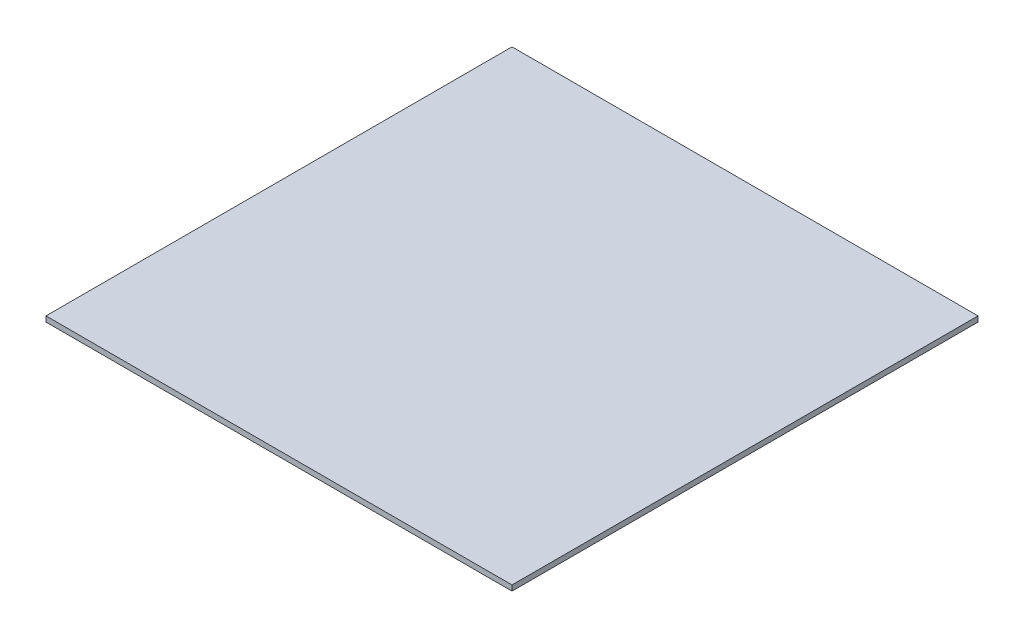
ISO-10303-21;
HEADER;
FILE_DESCRIPTION(('STEP AP214'),'2;1');
FILE_NAME('part.step','',(''),(''),'','','');
FILE_SCHEMA(('AUTOMOTIVE_DESIGN { 1 0 10303 214 1 1 1 1 }'));
ENDSEC;
DATA;
#1=APPLICATION_CONTEXT('core data for automotive mechanical design processes');
#2=APPLICATION_PROTOCOL_DEFINITION('international standard','automotive_design',2000,#1);
#3=PRODUCT_CONTEXT('',#1,'mechanical');
#4=PRODUCT('Part','Part','',(#3));
#5=PRODUCT_RELATED_PRODUCT_CATEGORY('part','',(#4));
#6=PRODUCT_DEFINITION_FORMATION('','',#4);
#7=PRODUCT_DEFINITION_CONTEXT('part definition',#1,'design');
#8=PRODUCT_DEFINITION('design','',#6,#7);
#9=PRODUCT_DEFINITION_SHAPE('','',#8);
#10=(LENGTH_UNIT() NAMED_UNIT(*) SI_UNIT(.MILLI.,.METRE.));
#11=(NAMED_UNIT(*) PLANE_ANGLE_UNIT() SI_UNIT($,.RADIAN.));
#12=(NAMED_UNIT(*) SI_UNIT($,.STERADIAN.) SOLID_ANGLE_UNIT());
#13=UNCERTAINTY_MEASURE_WITH_UNIT(LENGTH_MEASURE(1.E-05),#10,'distance_accuracy_value','');
#14=(GEOMETRIC_REPRESENTATION_CONTEXT(3) GLOBAL_UNCERTAINTY_ASSIGNED_CONTEXT((#13)) GLOBAL_UNIT_ASSIGNED_CONTEXT((#10,
#11,#12)) REPRESENTATION_CONTEXT('',''));
#15=CARTESIAN_POINT('',(0.,0.,0.));
#16=DIRECTION('',(0.,0.,1.));
#17=DIRECTION('',(1.,0.,0.));
#18=AXIS2_PLACEMENT_3D('',#15,#16,#17);
#19=CARTESIAN_POINT('',(-5002.83870967742,5.,-2278.45161290323));
#20=DIRECTION('',(1.,0.,0.));
#21=DIRECTION('',(0.,0.,-1.));
#22=AXIS2_PLACEMENT_3D('',#19,#20,#21);
#23=PLANE('',#22);
#24=DIRECTION('',(0.,0.,1.));
#25=VECTOR('',#24,1.);
#26=CARTESIAN_POINT('',(-5002.83870967742,0.,-2278.45161290323));
#27=LINE('',#26,#25);
#28=CARTESIAN_POINT('',(-5002.83870967742,0.,-2278.45161290323));
#29=VERTEX_POINT('',#28);
#30=CARTESIAN_POINT('',(-5002.83870967742,0.,-1846.45161290323));
#31=VERTEX_POINT('',#30);
#32=EDGE_CURVE('E95',#29,#31,#27,.T.);
#33=ORIENTED_EDGE('',*,*,#32,.T.);
#34=DIRECTION('',(0.,-1.,0.));
#35=VECTOR('',#34,1.);
#36=CARTESIAN_POINT('',(-5002.83870967742,5.,-1846.45161290323));
#37=LINE('',#36,#35);
#38=CARTESIAN_POINT('',(-5002.83870967742,5.,-1846.45161290323));
#39=VERTEX_POINT('',#38);
#40=EDGE_CURVE('E11',#39,#31,#37,.T.);
#41=ORIENTED_EDGE('',*,*,#40,.F.);
#42=DIRECTION('',(0.,0.,1.));
#43=VECTOR('',#42,1.);
#44=CARTESIAN_POINT('',(-5002.83870967742,5.,-2278.45161290323));
#45=LINE('',#44,#43);
#46=CARTESIAN_POINT('',(-5002.83870967742,5.,-2278.45161290323));
#47=VERTEX_POINT('',#46);
#48=EDGE_CURVE('E83',#47,#39,#45,.T.);
#49=ORIENTED_EDGE('',*,*,#48,.F.);
#50=DIRECTION('',(0.,-1.,0.));
#51=VECTOR('',#50,1.);
#52=CARTESIAN_POINT('',(-5002.83870967742,5.,-2278.45161290323));
#53=LINE('',#52,#51);
#54=EDGE_CURVE('E91',#47,#29,#53,.T.);
#55=ORIENTED_EDGE('',*,*,#54,.T.);
#56=EDGE_LOOP('',(#33,#41,#49,#55));
#57=FACE_BOUND('',#56,.T.);
#58=ADVANCED_FACE('F32',(#57),#23,.F.);
#59=CARTESIAN_POINT('',(-5002.83870967742,5.,-1846.45161290323));
#60=DIRECTION('',(0.,0.,-1.));
#61=DIRECTION('',(-1.,0.,0.));
#62=AXIS2_PLACEMENT_3D('',#59,#60,#61);
#63=PLANE('',#62);
#64=DIRECTION('',(1.,0.,0.));
#65=VECTOR('',#64,1.);
#66=CARTESIAN_POINT('',(-5002.83870967742,0.,-1846.45161290323));
#67=LINE('',#66,#65);
#68=CARTESIAN_POINT('',(-4570.83870967742,0.,-1846.45161290323));
#69=VERTEX_POINT('',#68);
#70=EDGE_CURVE('E87',#31,#69,#67,.T.);
#71=ORIENTED_EDGE('',*,*,#70,.T.);
#72=DIRECTION('',(0.,-1.,0.));
#73=VECTOR('',#72,1.);
#74=CARTESIAN_POINT('',(-4570.83870967742,5.,-1846.45161290323));
#75=LINE('',#74,#73);
#76=CARTESIAN_POINT('',(-4570.83870967742,5.,-1846.45161290323));
#77=VERTEX_POINT('',#76);
#78=EDGE_CURVE('E40',#77,#69,#75,.T.);
#79=ORIENTED_EDGE('',*,*,#78,.F.);
#80=DIRECTION('',(1.,0.,0.));
#81=VECTOR('',#80,1.);
#82=CARTESIAN_POINT('',(-5002.83870967742,5.,-1846.45161290323));
#83=LINE('',#82,#81);
#84=EDGE_CURVE('E78',#39,#77,#83,.T.);
#85=ORIENTED_EDGE('',*,*,#84,.F.);
#86=ORIENTED_EDGE('',*,*,#40,.T.);
#87=EDGE_LOOP('',(#71,#79,#85,#86));
#88=FACE_BOUND('',#87,.T.);
#89=ADVANCED_FACE('F86',(#88),#63,.F.);
#90=CARTESIAN_POINT('',(-4570.83870967742,5.,-2278.45161290323));
#91=DIRECTION('',(-1.,0.,0.));
#92=DIRECTION('',(0.,0.,1.));
#93=AXIS2_PLACEMENT_3D('',#90,#91,#92);
#94=PLANE('',#93);
#95=DIRECTION('',(0.,0.,-1.));
#96=VECTOR('',#95,1.);
#97=CARTESIAN_POINT('',(-4570.83870967742,0.,-2278.45161290323));
#98=LINE('',#97,#96);
#99=CARTESIAN_POINT('',(-4570.83870967742,0.,-2278.45161290323));
#100=VERTEX_POINT('',#99);
#101=EDGE_CURVE('E65',#69,#100,#98,.T.);
#102=ORIENTED_EDGE('',*,*,#101,.T.);
#103=DIRECTION('',(0.,-1.,0.));
#104=VECTOR('',#103,1.);
#105=CARTESIAN_POINT('',(-4570.83870967742,5.,-2278.45161290323));
#106=LINE('',#105,#104);
#107=CARTESIAN_POINT('',(-4570.83870967742,5.,-2278.45161290323));
#108=VERTEX_POINT('',#107);
#109=EDGE_CURVE('E88',#108,#100,#106,.T.);
#110=ORIENTED_EDGE('',*,*,#109,.F.);
#111=DIRECTION('',(0.,0.,-1.));
#112=VECTOR('',#111,1.);
#113=CARTESIAN_POINT('',(-4570.83870967742,5.,-2278.45161290323));
#114=LINE('',#113,#112);
#115=EDGE_CURVE('E81',#77,#108,#114,.T.);
#116=ORIENTED_EDGE('',*,*,#115,.F.);
#117=ORIENTED_EDGE('',*,*,#78,.T.);
#118=EDGE_LOOP('',(#102,#110,#116,#117));
#119=FACE_BOUND('',#118,.T.);
#120=ADVANCED_FACE('F89',(#119),#94,.F.);
#121=CARTESIAN_POINT('',(-5002.83870967742,5.,-2278.45161290323));
#122=DIRECTION('',(0.,0.,1.));
#123=DIRECTION('',(1.,0.,0.));
#124=AXIS2_PLACEMENT_3D('',#121,#122,#123);
#125=PLANE('',#124);
#126=DIRECTION('',(-1.,0.,0.));
#127=VECTOR('',#126,1.);
#128=CARTESIAN_POINT('',(-5002.83870967742,0.,-2278.45161290323));
#129=LINE('',#128,#127);
#130=EDGE_CURVE('E71',#100,#29,#129,.T.);
#131=ORIENTED_EDGE('',*,*,#130,.T.);
#132=ORIENTED_EDGE('',*,*,#54,.F.);
#133=DIRECTION('',(-1.,0.,0.));
#134=VECTOR('',#133,1.);
#135=CARTESIAN_POINT('',(-5002.83870967742,5.,-2278.45161290323));
#136=LINE('',#135,#134);
#137=EDGE_CURVE('E48',#108,#47,#136,.T.);
#138=ORIENTED_EDGE('',*,*,#137,.F.);
#139=ORIENTED_EDGE('',*,*,#109,.T.);
#140=EDGE_LOOP('',(#131,#132,#138,#139));
#141=FACE_BOUND('',#140,.T.);
#142=ADVANCED_FACE('F102',(#141),#125,.F.);
#143=CARTESIAN_POINT('',(0.,5.,0.));
#144=DIRECTION('',(0.,1.,0.));
#145=DIRECTION('',(0.,0.,1.));
#146=AXIS2_PLACEMENT_3D('',#143,#144,#145);
#147=PLANE('',#146);
#148=ORIENTED_EDGE('',*,*,#48,.T.);
#149=ORIENTED_EDGE('',*,*,#84,.T.);
#150=ORIENTED_EDGE('',*,*,#115,.T.);
#151=ORIENTED_EDGE('',*,*,#137,.T.);
#152=EDGE_LOOP('',(#148,#149,#150,#151));
#153=FACE_BOUND('',#152,.T.);
#154=ADVANCED_FACE('F79',(#153),#147,.T.);
#155=CARTESIAN_POINT('',(0.,0.,0.));
#156=DIRECTION('',(0.,1.,0.));
#157=DIRECTION('',(0.,0.,1.));
#158=AXIS2_PLACEMENT_3D('',#155,#156,#157);
#159=PLANE('',#158);
#160=ORIENTED_EDGE('',*,*,#32,.F.);
#161=ORIENTED_EDGE('',*,*,#130,.F.);
#162=ORIENTED_EDGE('',*,*,#101,.F.);
#163=ORIENTED_EDGE('',*,*,#70,.F.);
#164=EDGE_LOOP('',(#160,#161,#162,#163));
#165=FACE_BOUND('',#164,.T.);
#166=ADVANCED_FACE('F105',(#165),#159,.F.);
#167=CLOSED_SHELL('',(#58,#89,#120,#142,#154,#166));
#168=MANIFOLD_SOLID_BREP('B2',#167);
#169=ADVANCED_BREP_SHAPE_REPRESENTATION('',(#18,#168),#14);
#170=SHAPE_DEFINITION_REPRESENTATION(#9,#169);
ENDSEC;
END-ISO-10303-21;
